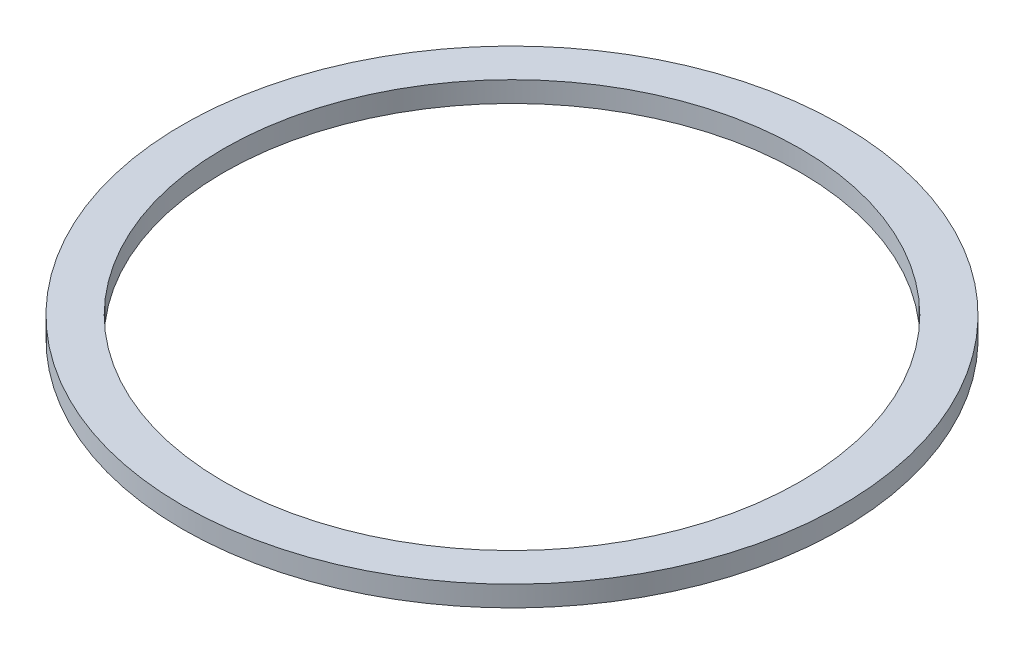
ISO-10303-21;
HEADER;
FILE_DESCRIPTION(('STEP AP214'),'2;1');
FILE_NAME('part.step','',(''),(''),'','','');
FILE_SCHEMA(('AUTOMOTIVE_DESIGN { 1 0 10303 214 1 1 1 1 }'));
ENDSEC;
DATA;
#1=APPLICATION_CONTEXT('core data for automotive mechanical design processes');
#2=APPLICATION_PROTOCOL_DEFINITION('international standard','automotive_design',2000,#1);
#3=PRODUCT_CONTEXT('',#1,'mechanical');
#4=PRODUCT('Part','Part','',(#3));
#5=PRODUCT_RELATED_PRODUCT_CATEGORY('part','',(#4));
#6=PRODUCT_DEFINITION_FORMATION('','',#4);
#7=PRODUCT_DEFINITION_CONTEXT('part definition',#1,'design');
#8=PRODUCT_DEFINITION('design','',#6,#7);
#9=PRODUCT_DEFINITION_SHAPE('','',#8);
#10=(LENGTH_UNIT() NAMED_UNIT(*) SI_UNIT(.MILLI.,.METRE.));
#11=(NAMED_UNIT(*) PLANE_ANGLE_UNIT() SI_UNIT($,.RADIAN.));
#12=(NAMED_UNIT(*) SI_UNIT($,.STERADIAN.) SOLID_ANGLE_UNIT());
#13=UNCERTAINTY_MEASURE_WITH_UNIT(LENGTH_MEASURE(1.E-05),#10,'distance_accuracy_value','');
#14=(GEOMETRIC_REPRESENTATION_CONTEXT(3) GLOBAL_UNCERTAINTY_ASSIGNED_CONTEXT((#13)) GLOBAL_UNIT_ASSIGNED_CONTEXT((#10,
#11,#12)) REPRESENTATION_CONTEXT('',''));
#15=CARTESIAN_POINT('',(0.,0.,0.));
#16=DIRECTION('',(0.,0.,1.));
#17=DIRECTION('',(1.,0.,0.));
#18=AXIS2_PLACEMENT_3D('',#15,#16,#17);
#19=CARTESIAN_POINT('',(0.,0.5,0.));
#20=DIRECTION('',(0.,1.,0.));
#21=DIRECTION('',(0.,0.,1.));
#22=AXIS2_PLACEMENT_3D('',#19,#20,#21);
#23=PLANE('',#22);
#24=CARTESIAN_POINT('',(0.,0.5,0.));
#25=DIRECTION('',(0.,1.,0.));
#26=DIRECTION('',(0.,0.,1.));
#27=AXIS2_PLACEMENT_3D('',#24,#25,#26);
#28=CIRCLE('',#27,8.);
#29=CARTESIAN_POINT('',(0.,0.5,8.));
#30=VERTEX_POINT('',#29);
#31=EDGE_CURVE('E10',#30,#30,#28,.T.);
#32=ORIENTED_EDGE('',*,*,#31,.T.);
#33=EDGE_LOOP('',(#32));
#34=FACE_BOUND('',#33,.T.);
#35=CARTESIAN_POINT('',(0.,0.5,0.));
#36=DIRECTION('',(0.,1.,0.));
#37=DIRECTION('',(0.,0.,1.));
#38=AXIS2_PLACEMENT_3D('',#35,#36,#37);
#39=CIRCLE('',#38,7.);
#40=CARTESIAN_POINT('',(0.,0.5,7.));
#41=VERTEX_POINT('',#40);
#42=EDGE_CURVE('E58',#41,#41,#39,.T.);
#43=ORIENTED_EDGE('',*,*,#42,.F.);
#44=EDGE_LOOP('',(#43));
#45=FACE_BOUND('',#44,.T.);
#46=ADVANCED_FACE('F45',(#34,#45),#23,.T.);
#47=CARTESIAN_POINT('',(0.,0.,0.));
#48=DIRECTION('',(0.,1.,0.));
#49=DIRECTION('',(0.,0.,1.));
#50=AXIS2_PLACEMENT_3D('',#47,#48,#49);
#51=PLANE('',#50);
#52=CARTESIAN_POINT('',(0.,0.,0.));
#53=DIRECTION('',(0.,1.,0.));
#54=DIRECTION('',(0.,0.,1.));
#55=AXIS2_PLACEMENT_3D('',#52,#53,#54);
#56=CIRCLE('',#55,8.);
#57=CARTESIAN_POINT('',(0.,0.,8.));
#58=VERTEX_POINT('',#57);
#59=EDGE_CURVE('E49',#58,#58,#56,.T.);
#60=ORIENTED_EDGE('',*,*,#59,.F.);
#61=EDGE_LOOP('',(#60));
#62=FACE_BOUND('',#61,.T.);
#63=CARTESIAN_POINT('',(0.,0.,0.));
#64=DIRECTION('',(0.,1.,0.));
#65=DIRECTION('',(0.,0.,1.));
#66=AXIS2_PLACEMENT_3D('',#63,#64,#65);
#67=CIRCLE('',#66,7.);
#68=CARTESIAN_POINT('',(0.,0.,7.));
#69=VERTEX_POINT('',#68);
#70=EDGE_CURVE('E60',#69,#69,#67,.T.);
#71=ORIENTED_EDGE('',*,*,#70,.T.);
#72=EDGE_LOOP('',(#71));
#73=FACE_BOUND('',#72,.T.);
#74=ADVANCED_FACE('F72',(#62,#73),#51,.F.);
#75=CARTESIAN_POINT('',(0.,0.5,0.));
#76=DIRECTION('',(0.,-1.,0.));
#77=DIRECTION('',(0.,0.,-1.));
#78=AXIS2_PLACEMENT_3D('',#75,#76,#77);
#79=CYLINDRICAL_SURFACE('',#78,8.);
#80=ORIENTED_EDGE('',*,*,#31,.F.);
#81=EDGE_LOOP('',(#80));
#82=FACE_BOUND('',#81,.T.);
#83=ORIENTED_EDGE('',*,*,#59,.T.);
#84=EDGE_LOOP('',(#83));
#85=FACE_BOUND('',#84,.T.);
#86=ADVANCED_FACE('F47',(#82,#85),#79,.T.);
#87=CARTESIAN_POINT('',(0.,0.5,0.));
#88=DIRECTION('',(0.,-1.,0.));
#89=DIRECTION('',(0.,0.,-1.));
#90=AXIS2_PLACEMENT_3D('',#87,#88,#89);
#91=CYLINDRICAL_SURFACE('',#90,7.);
#92=ORIENTED_EDGE('',*,*,#42,.T.);
#93=EDGE_LOOP('',(#92));
#94=FACE_BOUND('',#93,.T.);
#95=ORIENTED_EDGE('',*,*,#70,.F.);
#96=EDGE_LOOP('',(#95));
#97=FACE_BOUND('',#96,.T.);
#98=ADVANCED_FACE('F68',(#94,#97),#91,.F.);
#99=CLOSED_SHELL('',(#46,#74,#86,#98));
#100=MANIFOLD_SOLID_BREP('B2',#99);
#101=ADVANCED_BREP_SHAPE_REPRESENTATION('',(#18,#100),#14);
#102=SHAPE_DEFINITION_REPRESENTATION(#9,#101);
ENDSEC;
END-ISO-10303-21;
